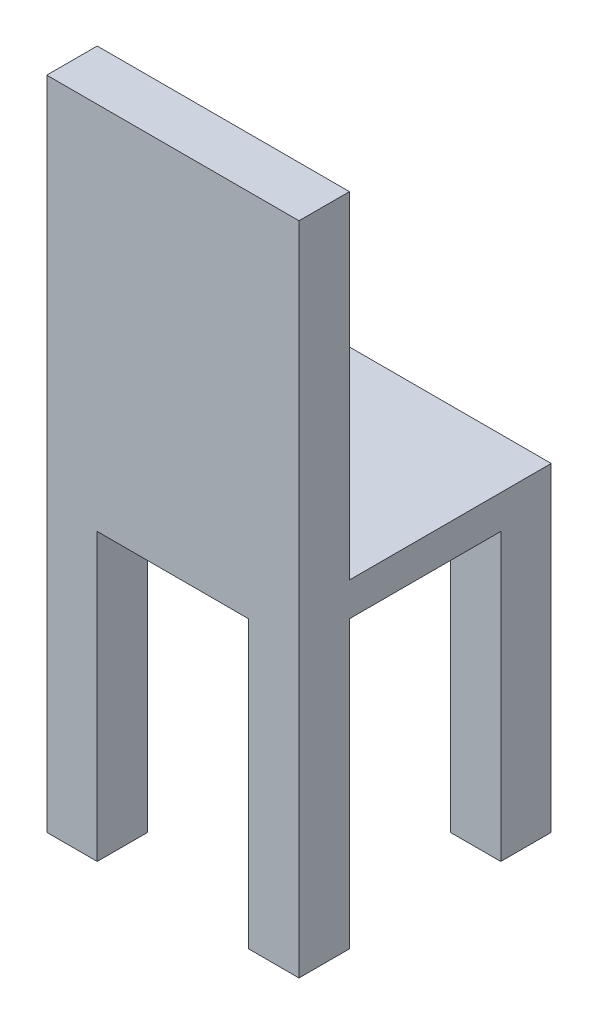
ISO-10303-21;
HEADER;
FILE_DESCRIPTION(('STEP AP214'),'2;1');
FILE_NAME('part.step','',(''),(''),'','','');
FILE_SCHEMA(('AUTOMOTIVE_DESIGN { 1 0 10303 214 1 1 1 1 }'));
ENDSEC;
DATA;
#1=APPLICATION_CONTEXT('core data for automotive mechanical design processes');
#2=APPLICATION_PROTOCOL_DEFINITION('international standard','automotive_design',2000,#1);
#3=PRODUCT_CONTEXT('',#1,'mechanical');
#4=PRODUCT('Part','Part','',(#3));
#5=PRODUCT_RELATED_PRODUCT_CATEGORY('part','',(#4));
#6=PRODUCT_DEFINITION_FORMATION('','',#4);
#7=PRODUCT_DEFINITION_CONTEXT('part definition',#1,'design');
#8=PRODUCT_DEFINITION('design','',#6,#7);
#9=PRODUCT_DEFINITION_SHAPE('','',#8);
#10=(LENGTH_UNIT() NAMED_UNIT(*) SI_UNIT(.MILLI.,.METRE.));
#11=(NAMED_UNIT(*) PLANE_ANGLE_UNIT() SI_UNIT($,.RADIAN.));
#12=(NAMED_UNIT(*) SI_UNIT($,.STERADIAN.) SOLID_ANGLE_UNIT());
#13=UNCERTAINTY_MEASURE_WITH_UNIT(LENGTH_MEASURE(1.E-05),#10,'distance_accuracy_value','');
#14=(GEOMETRIC_REPRESENTATION_CONTEXT(3) GLOBAL_UNCERTAINTY_ASSIGNED_CONTEXT((#13)) GLOBAL_UNIT_ASSIGNED_CONTEXT((#10,
#11,#12)) REPRESENTATION_CONTEXT('',''));
#15=CARTESIAN_POINT('',(0.,0.,0.));
#16=DIRECTION('',(0.,0.,1.));
#17=DIRECTION('',(1.,0.,0.));
#18=AXIS2_PLACEMENT_3D('',#15,#16,#17);
#19=CARTESIAN_POINT('',(0.,19.,0.));
#20=DIRECTION('',(0.,1.,0.));
#21=DIRECTION('',(0.,0.,1.));
#22=AXIS2_PLACEMENT_3D('',#19,#20,#21);
#23=PLANE('',#22);
#24=DIRECTION('',(0.,0.,1.));
#25=VECTOR('',#24,1.);
#26=CARTESIAN_POINT('',(22.1016011392974,19.,45.));
#27=LINE('',#26,#25);
#28=CARTESIAN_POINT('',(22.1016011392974,19.,45.));
#29=VERTEX_POINT('',#28);
#30=CARTESIAN_POINT('',(22.1016011392974,19.,48.));
#31=VERTEX_POINT('',#30);
#32=EDGE_CURVE('E216',#29,#31,#27,.T.);
#33=ORIENTED_EDGE('',*,*,#32,.T.);
#34=DIRECTION('',(1.,0.,0.));
#35=VECTOR('',#34,1.);
#36=CARTESIAN_POINT('',(25.1016011392974,19.,48.));
#37=LINE('',#36,#35);
#38=CARTESIAN_POINT('',(25.1016011392974,19.,48.));
#39=VERTEX_POINT('',#38);
#40=EDGE_CURVE('E211',#31,#39,#37,.T.);
#41=ORIENTED_EDGE('',*,*,#40,.T.);
#42=DIRECTION('',(0.,0.,-1.));
#43=VECTOR('',#42,1.);
#44=CARTESIAN_POINT('',(25.1016011392974,19.,45.));
#45=LINE('',#44,#43);
#46=CARTESIAN_POINT('',(25.1016011392974,19.,57.));
#47=VERTEX_POINT('',#46);
#48=EDGE_CURVE('E284',#47,#39,#45,.T.);
#49=ORIENTED_EDGE('',*,*,#48,.F.);
#50=DIRECTION('',(-1.,0.,0.));
#51=VECTOR('',#50,1.);
#52=CARTESIAN_POINT('',(25.1016011392974,19.,57.));
#53=LINE('',#52,#51);
#54=CARTESIAN_POINT('',(22.1016011392974,19.,57.));
#55=VERTEX_POINT('',#54);
#56=EDGE_CURVE('E42',#47,#55,#53,.T.);
#57=ORIENTED_EDGE('',*,*,#56,.T.);
#58=DIRECTION('',(0.,0.,1.));
#59=VECTOR('',#58,1.);
#60=CARTESIAN_POINT('',(22.1016011392974,19.,60.));
#61=LINE('',#60,#59);
#62=CARTESIAN_POINT('',(22.1016011392974,19.,60.));
#63=VERTEX_POINT('',#62);
#64=EDGE_CURVE('E299',#55,#63,#61,.T.);
#65=ORIENTED_EDGE('',*,*,#64,.T.);
#66=DIRECTION('',(1.,0.,0.));
#67=VECTOR('',#66,1.);
#68=CARTESIAN_POINT('',(10.1016011392974,19.,60.));
#69=LINE('',#68,#67);
#70=CARTESIAN_POINT('',(13.1016011392974,19.,60.));
#71=VERTEX_POINT('',#70);
#72=EDGE_CURVE('E282',#71,#63,#69,.T.);
#73=ORIENTED_EDGE('',*,*,#72,.F.);
#74=DIRECTION('',(0.,0.,-1.));
#75=VECTOR('',#74,1.);
#76=CARTESIAN_POINT('',(13.1016011392974,19.,60.));
#77=LINE('',#76,#75);
#78=CARTESIAN_POINT('',(13.1016011392974,19.,57.));
#79=VERTEX_POINT('',#78);
#80=EDGE_CURVE('E262',#71,#79,#77,.T.);
#81=ORIENTED_EDGE('',*,*,#80,.T.);
#82=DIRECTION('',(-1.,0.,0.));
#83=VECTOR('',#82,1.);
#84=CARTESIAN_POINT('',(10.1016011392974,19.,57.));
#85=LINE('',#84,#83);
#86=CARTESIAN_POINT('',(10.1016011392974,19.,57.));
#87=VERTEX_POINT('',#86);
#88=EDGE_CURVE('E259',#79,#87,#85,.T.);
#89=ORIENTED_EDGE('',*,*,#88,.T.);
#90=DIRECTION('',(0.,0.,1.));
#91=VECTOR('',#90,1.);
#92=CARTESIAN_POINT('',(10.1016011392974,19.,45.));
#93=LINE('',#92,#91);
#94=CARTESIAN_POINT('',(10.1016011392974,19.,48.));
#95=VERTEX_POINT('',#94);
#96=EDGE_CURVE('E268',#95,#87,#93,.T.);
#97=ORIENTED_EDGE('',*,*,#96,.F.);
#98=DIRECTION('',(1.,0.,0.));
#99=VECTOR('',#98,1.);
#100=CARTESIAN_POINT('',(10.1016011392974,19.,48.));
#101=LINE('',#100,#99);
#102=CARTESIAN_POINT('',(13.1016011392974,19.,48.));
#103=VERTEX_POINT('',#102);
#104=EDGE_CURVE('E230',#95,#103,#101,.T.);
#105=ORIENTED_EDGE('',*,*,#104,.T.);
#106=DIRECTION('',(0.,0.,-1.));
#107=VECTOR('',#106,1.);
#108=CARTESIAN_POINT('',(13.1016011392974,19.,45.));
#109=LINE('',#108,#107);
#110=CARTESIAN_POINT('',(13.1016011392974,19.,45.));
#111=VERTEX_POINT('',#110);
#112=EDGE_CURVE('E227',#103,#111,#109,.T.);
#113=ORIENTED_EDGE('',*,*,#112,.T.);
#114=DIRECTION('',(-1.,0.,0.));
#115=VECTOR('',#114,1.);
#116=CARTESIAN_POINT('',(10.1016011392974,19.,45.));
#117=LINE('',#116,#115);
#118=EDGE_CURVE('E276',#29,#111,#117,.T.);
#119=ORIENTED_EDGE('',*,*,#118,.F.);
#120=EDGE_LOOP('',(#33,#41,#49,#57,#65,#73,#81,#89,#97,#105,#113,#119));
#121=FACE_BOUND('',#120,.T.);
#122=ADVANCED_FACE('F38',(#121),#23,.F.);
#123=CARTESIAN_POINT('',(25.1016011392974,19.,60.));
#124=DIRECTION('',(-1.,0.,0.));
#125=DIRECTION('',(0.,0.,1.));
#126=AXIS2_PLACEMENT_3D('',#123,#124,#125);
#127=PLANE('',#126);
#128=DIRECTION('',(0.,0.,-1.));
#129=VECTOR('',#128,1.);
#130=CARTESIAN_POINT('',(25.1016011392974,2.,60.));
#131=LINE('',#130,#129);
#132=CARTESIAN_POINT('',(25.1016011392974,2.,60.));
#133=VERTEX_POINT('',#132);
#134=CARTESIAN_POINT('',(25.1016011392974,2.,57.));
#135=VERTEX_POINT('',#134);
#136=EDGE_CURVE('E11',#133,#135,#131,.T.);
#137=ORIENTED_EDGE('',*,*,#136,.T.);
#138=DIRECTION('',(0.,-1.,0.));
#139=VECTOR('',#138,1.);
#140=CARTESIAN_POINT('',(25.1016011392974,19.,57.));
#141=LINE('',#140,#139);
#142=EDGE_CURVE('E178',#47,#135,#141,.T.);
#143=ORIENTED_EDGE('',*,*,#142,.F.);
#144=ORIENTED_EDGE('',*,*,#48,.T.);
#145=DIRECTION('',(0.,-1.,0.));
#146=VECTOR('',#145,1.);
#147=CARTESIAN_POINT('',(25.1016011392974,19.,48.));
#148=LINE('',#147,#146);
#149=CARTESIAN_POINT('',(25.1016011392974,2.,48.));
#150=VERTEX_POINT('',#149);
#151=EDGE_CURVE('E208',#39,#150,#148,.T.);
#152=ORIENTED_EDGE('',*,*,#151,.T.);
#153=DIRECTION('',(0.,0.,-1.));
#154=VECTOR('',#153,1.);
#155=CARTESIAN_POINT('',(25.1016011392974,2.,45.));
#156=LINE('',#155,#154);
#157=CARTESIAN_POINT('',(25.1016011392974,2.,45.));
#158=VERTEX_POINT('',#157);
#159=EDGE_CURVE('E212',#150,#158,#156,.T.);
#160=ORIENTED_EDGE('',*,*,#159,.T.);
#161=DIRECTION('',(0.,-1.,0.));
#162=VECTOR('',#161,1.);
#163=CARTESIAN_POINT('',(25.1016011392974,21.,45.));
#164=LINE('',#163,#162);
#165=CARTESIAN_POINT('',(25.1016011392974,21.,45.));
#166=VERTEX_POINT('',#165);
#167=EDGE_CURVE('E179',#166,#158,#164,.T.);
#168=ORIENTED_EDGE('',*,*,#167,.F.);
#169=DIRECTION('',(0.,0.,-1.));
#170=VECTOR('',#169,1.);
#171=CARTESIAN_POINT('',(25.1016011392974,21.,45.));
#172=LINE('',#171,#170);
#173=CARTESIAN_POINT('',(25.1016011392974,21.,57.));
#174=VERTEX_POINT('',#173);
#175=EDGE_CURVE('E275',#174,#166,#172,.T.);
#176=ORIENTED_EDGE('',*,*,#175,.F.);
#177=DIRECTION('',(0.,-1.,0.));
#178=VECTOR('',#177,1.);
#179=CARTESIAN_POINT('',(25.1016011392974,41.,57.));
#180=LINE('',#179,#178);
#181=CARTESIAN_POINT('',(25.1016011392974,41.,57.));
#182=VERTEX_POINT('',#181);
#183=EDGE_CURVE('E201',#182,#174,#180,.T.);
#184=ORIENTED_EDGE('',*,*,#183,.F.);
#185=DIRECTION('',(0.,0.,-1.));
#186=VECTOR('',#185,1.);
#187=CARTESIAN_POINT('',(25.1016011392974,41.,60.));
#188=LINE('',#187,#186);
#189=CARTESIAN_POINT('',(25.1016011392974,41.,60.));
#190=VERTEX_POINT('',#189);
#191=EDGE_CURVE('E188',#190,#182,#188,.T.);
#192=ORIENTED_EDGE('',*,*,#191,.F.);
#193=DIRECTION('',(0.,-1.,0.));
#194=VECTOR('',#193,1.);
#195=CARTESIAN_POINT('',(25.1016011392974,19.,60.));
#196=LINE('',#195,#194);
#197=EDGE_CURVE('E185',#190,#133,#196,.T.);
#198=ORIENTED_EDGE('',*,*,#197,.T.);
#199=EDGE_LOOP('',(#137,#143,#144,#152,#160,#168,#176,#184,#192,#198));
#200=FACE_BOUND('',#199,.T.);
#201=ADVANCED_FACE('F314',(#200),#127,.F.);
#202=CARTESIAN_POINT('',(25.1016011392974,19.,57.));
#203=DIRECTION('',(0.,0.,1.));
#204=DIRECTION('',(1.,0.,0.));
#205=AXIS2_PLACEMENT_3D('',#202,#203,#204);
#206=PLANE('',#205);
#207=DIRECTION('',(-1.,0.,0.));
#208=VECTOR('',#207,1.);
#209=CARTESIAN_POINT('',(25.1016011392974,2.,57.));
#210=LINE('',#209,#208);
#211=CARTESIAN_POINT('',(22.1016011392974,2.,57.));
#212=VERTEX_POINT('',#211);
#213=EDGE_CURVE('E47',#135,#212,#210,.T.);
#214=ORIENTED_EDGE('',*,*,#213,.T.);
#215=DIRECTION('',(0.,-1.,0.));
#216=VECTOR('',#215,1.);
#217=CARTESIAN_POINT('',(22.1016011392974,19.,57.));
#218=LINE('',#217,#216);
#219=EDGE_CURVE('E292',#55,#212,#218,.T.);
#220=ORIENTED_EDGE('',*,*,#219,.F.);
#221=ORIENTED_EDGE('',*,*,#56,.F.);
#222=ORIENTED_EDGE('',*,*,#142,.T.);
#223=EDGE_LOOP('',(#214,#220,#221,#222));
#224=FACE_BOUND('',#223,.T.);
#225=ADVANCED_FACE('F312',(#224),#206,.F.);
#226=CARTESIAN_POINT('',(22.1016011392974,19.,60.));
#227=DIRECTION('',(1.,0.,0.));
#228=DIRECTION('',(0.,0.,-1.));
#229=AXIS2_PLACEMENT_3D('',#226,#227,#228);
#230=PLANE('',#229);
#231=DIRECTION('',(0.,0.,1.));
#232=VECTOR('',#231,1.);
#233=CARTESIAN_POINT('',(22.1016011392974,2.,60.));
#234=LINE('',#233,#232);
#235=CARTESIAN_POINT('',(22.1016011392974,2.,60.));
#236=VERTEX_POINT('',#235);
#237=EDGE_CURVE('E302',#212,#236,#234,.T.);
#238=ORIENTED_EDGE('',*,*,#237,.T.);
#239=DIRECTION('',(0.,-1.,0.));
#240=VECTOR('',#239,1.);
#241=CARTESIAN_POINT('',(22.1016011392974,19.,60.));
#242=LINE('',#241,#240);
#243=EDGE_CURVE('E295',#63,#236,#242,.T.);
#244=ORIENTED_EDGE('',*,*,#243,.F.);
#245=ORIENTED_EDGE('',*,*,#64,.F.);
#246=ORIENTED_EDGE('',*,*,#219,.T.);
#247=EDGE_LOOP('',(#238,#244,#245,#246));
#248=FACE_BOUND('',#247,.T.);
#249=ADVANCED_FACE('F320',(#248),#230,.F.);
#250=CARTESIAN_POINT('',(25.1016011392974,19.,60.));
#251=DIRECTION('',(0.,0.,-1.));
#252=DIRECTION('',(-1.,0.,0.));
#253=AXIS2_PLACEMENT_3D('',#250,#251,#252);
#254=PLANE('',#253);
#255=DIRECTION('',(1.,0.,0.));
#256=VECTOR('',#255,1.);
#257=CARTESIAN_POINT('',(25.1016011392974,2.,60.));
#258=LINE('',#257,#256);
#259=EDGE_CURVE('E300',#236,#133,#258,.T.);
#260=ORIENTED_EDGE('',*,*,#259,.T.);
#261=ORIENTED_EDGE('',*,*,#197,.F.);
#262=DIRECTION('',(1.,0.,0.));
#263=VECTOR('',#262,1.);
#264=CARTESIAN_POINT('',(10.1016011392974,41.,60.));
#265=LINE('',#264,#263);
#266=CARTESIAN_POINT('',(10.1016011392974,41.,60.));
#267=VERTEX_POINT('',#266);
#268=EDGE_CURVE('E182',#267,#190,#265,.T.);
#269=ORIENTED_EDGE('',*,*,#268,.F.);
#270=DIRECTION('',(0.,-1.,0.));
#271=VECTOR('',#270,1.);
#272=CARTESIAN_POINT('',(10.1016011392974,21.,60.));
#273=LINE('',#272,#271);
#274=CARTESIAN_POINT('',(10.1016011392974,2.,60.));
#275=VERTEX_POINT('',#274);
#276=EDGE_CURVE('E166',#267,#275,#273,.T.);
#277=ORIENTED_EDGE('',*,*,#276,.T.);
#278=DIRECTION('',(1.,0.,0.));
#279=VECTOR('',#278,1.);
#280=CARTESIAN_POINT('',(10.1016011392974,2.,60.));
#281=LINE('',#280,#279);
#282=CARTESIAN_POINT('',(13.1016011392974,2.,60.));
#283=VERTEX_POINT('',#282);
#284=EDGE_CURVE('E266',#275,#283,#281,.T.);
#285=ORIENTED_EDGE('',*,*,#284,.T.);
#286=DIRECTION('',(0.,-1.,0.));
#287=VECTOR('',#286,1.);
#288=CARTESIAN_POINT('',(13.1016011392974,19.,60.));
#289=LINE('',#288,#287);
#290=EDGE_CURVE('E251',#71,#283,#289,.T.);
#291=ORIENTED_EDGE('',*,*,#290,.F.);
#292=ORIENTED_EDGE('',*,*,#72,.T.);
#293=ORIENTED_EDGE('',*,*,#243,.T.);
#294=EDGE_LOOP('',(#260,#261,#269,#277,#285,#291,#292,#293));
#295=FACE_BOUND('',#294,.T.);
#296=ADVANCED_FACE('F183',(#295),#254,.F.);
#297=CARTESIAN_POINT('',(0.,2.,0.));
#298=DIRECTION('',(0.,1.,0.));
#299=DIRECTION('',(0.,0.,1.));
#300=AXIS2_PLACEMENT_3D('',#297,#298,#299);
#301=PLANE('',#300);
#302=ORIENTED_EDGE('',*,*,#136,.F.);
#303=ORIENTED_EDGE('',*,*,#259,.F.);
#304=ORIENTED_EDGE('',*,*,#237,.F.);
#305=ORIENTED_EDGE('',*,*,#213,.F.);
#306=EDGE_LOOP('',(#302,#303,#304,#305));
#307=FACE_BOUND('',#306,.T.);
#308=ADVANCED_FACE('F40',(#307),#301,.F.);
#309=CARTESIAN_POINT('',(10.1016011392974,21.,45.));
#310=DIRECTION('',(1.,0.,0.));
#311=DIRECTION('',(0.,0.,-1.));
#312=AXIS2_PLACEMENT_3D('',#309,#310,#311);
#313=PLANE('',#312);
#314=DIRECTION('',(0.,-1.,0.));
#315=VECTOR('',#314,1.);
#316=CARTESIAN_POINT('',(10.1016011392974,21.,45.));
#317=LINE('',#316,#315);
#318=CARTESIAN_POINT('',(10.1016011392974,21.,45.));
#319=VERTEX_POINT('',#318);
#320=CARTESIAN_POINT('',(10.1016011392974,2.,45.));
#321=VERTEX_POINT('',#320);
#322=EDGE_CURVE('E280',#319,#321,#317,.T.);
#323=ORIENTED_EDGE('',*,*,#322,.T.);
#324=DIRECTION('',(0.,0.,1.));
#325=VECTOR('',#324,1.);
#326=CARTESIAN_POINT('',(10.1016011392974,2.,45.));
#327=LINE('',#326,#325);
#328=CARTESIAN_POINT('',(10.1016011392974,2.,48.));
#329=VERTEX_POINT('',#328);
#330=EDGE_CURVE('E240',#321,#329,#327,.T.);
#331=ORIENTED_EDGE('',*,*,#330,.T.);
#332=DIRECTION('',(0.,-1.,0.));
#333=VECTOR('',#332,1.);
#334=CARTESIAN_POINT('',(10.1016011392974,19.,48.));
#335=LINE('',#334,#333);
#336=EDGE_CURVE('E245',#95,#329,#335,.T.);
#337=ORIENTED_EDGE('',*,*,#336,.F.);
#338=ORIENTED_EDGE('',*,*,#96,.T.);
#339=DIRECTION('',(0.,-1.,0.));
#340=VECTOR('',#339,1.);
#341=CARTESIAN_POINT('',(10.1016011392974,19.,57.));
#342=LINE('',#341,#340);
#343=CARTESIAN_POINT('',(10.1016011392974,2.,57.));
#344=VERTEX_POINT('',#343);
#345=EDGE_CURVE('E257',#87,#344,#342,.T.);
#346=ORIENTED_EDGE('',*,*,#345,.T.);
#347=DIRECTION('',(0.,0.,1.));
#348=VECTOR('',#347,1.);
#349=CARTESIAN_POINT('',(10.1016011392974,2.,60.));
#350=LINE('',#349,#348);
#351=EDGE_CURVE('E174',#344,#275,#350,.T.);
#352=ORIENTED_EDGE('',*,*,#351,.T.);
#353=ORIENTED_EDGE('',*,*,#276,.F.);
#354=DIRECTION('',(0.,0.,1.));
#355=VECTOR('',#354,1.);
#356=CARTESIAN_POINT('',(10.1016011392974,41.,60.));
#357=LINE('',#356,#355);
#358=CARTESIAN_POINT('',(10.1016011392974,41.,57.));
#359=VERTEX_POINT('',#358);
#360=EDGE_CURVE('E171',#359,#267,#357,.T.);
#361=ORIENTED_EDGE('',*,*,#360,.F.);
#362=DIRECTION('',(0.,-1.,0.));
#363=VECTOR('',#362,1.);
#364=CARTESIAN_POINT('',(10.1016011392974,41.,57.));
#365=LINE('',#364,#363);
#366=CARTESIAN_POINT('',(10.1016011392974,21.,57.));
#367=VERTEX_POINT('',#366);
#368=EDGE_CURVE('E198',#359,#367,#365,.T.);
#369=ORIENTED_EDGE('',*,*,#368,.T.);
#370=DIRECTION('',(0.,0.,1.));
#371=VECTOR('',#370,1.);
#372=CARTESIAN_POINT('',(10.1016011392974,21.,45.));
#373=LINE('',#372,#371);
#374=EDGE_CURVE('E273',#319,#367,#373,.T.);
#375=ORIENTED_EDGE('',*,*,#374,.F.);
#376=EDGE_LOOP('',(#323,#331,#337,#338,#346,#352,#353,#361,#369,#375));
#377=FACE_BOUND('',#376,.T.);
#378=ADVANCED_FACE('F168',(#377),#313,.F.);
#379=CARTESIAN_POINT('',(10.1016011392974,21.,45.));
#380=DIRECTION('',(0.,0.,1.));
#381=DIRECTION('',(1.,0.,0.));
#382=AXIS2_PLACEMENT_3D('',#379,#380,#381);
#383=PLANE('',#382);
#384=ORIENTED_EDGE('',*,*,#167,.T.);
#385=DIRECTION('',(-1.,0.,0.));
#386=VECTOR('',#385,1.);
#387=CARTESIAN_POINT('',(25.1016011392974,2.,45.));
#388=LINE('',#387,#386);
#389=CARTESIAN_POINT('',(22.1016011392974,2.,45.));
#390=VERTEX_POINT('',#389);
#391=EDGE_CURVE('E220',#158,#390,#388,.T.);
#392=ORIENTED_EDGE('',*,*,#391,.T.);
#393=DIRECTION('',(0.,-1.,0.));
#394=VECTOR('',#393,1.);
#395=CARTESIAN_POINT('',(22.1016011392974,19.,45.));
#396=LINE('',#395,#394);
#397=EDGE_CURVE('E63',#29,#390,#396,.T.);
#398=ORIENTED_EDGE('',*,*,#397,.F.);
#399=ORIENTED_EDGE('',*,*,#118,.T.);
#400=DIRECTION('',(0.,-1.,0.));
#401=VECTOR('',#400,1.);
#402=CARTESIAN_POINT('',(13.1016011392974,19.,45.));
#403=LINE('',#402,#401);
#404=CARTESIAN_POINT('',(13.1016011392974,2.,45.));
#405=VERTEX_POINT('',#404);
#406=EDGE_CURVE('E248',#111,#405,#403,.T.);
#407=ORIENTED_EDGE('',*,*,#406,.T.);
#408=DIRECTION('',(-1.,0.,0.));
#409=VECTOR('',#408,1.);
#410=CARTESIAN_POINT('',(10.1016011392974,2.,45.));
#411=LINE('',#410,#409);
#412=EDGE_CURVE('E237',#405,#321,#411,.T.);
#413=ORIENTED_EDGE('',*,*,#412,.T.);
#414=ORIENTED_EDGE('',*,*,#322,.F.);
#415=DIRECTION('',(-1.,0.,0.));
#416=VECTOR('',#415,1.);
#417=CARTESIAN_POINT('',(10.1016011392974,21.,45.));
#418=LINE('',#417,#416);
#419=EDGE_CURVE('E278',#166,#319,#418,.T.);
#420=ORIENTED_EDGE('',*,*,#419,.F.);
#421=EDGE_LOOP('',(#384,#392,#398,#399,#407,#413,#414,#420));
#422=FACE_BOUND('',#421,.T.);
#423=ADVANCED_FACE('F353',(#422),#383,.F.);
#424=CARTESIAN_POINT('',(0.,21.,0.));
#425=DIRECTION('',(0.,1.,0.));
#426=DIRECTION('',(0.,0.,1.));
#427=AXIS2_PLACEMENT_3D('',#424,#425,#426);
#428=PLANE('',#427);
#429=DIRECTION('',(-1.,0.,0.));
#430=VECTOR('',#429,1.);
#431=CARTESIAN_POINT('',(10.1016011392974,21.,57.));
#432=LINE('',#431,#430);
#433=EDGE_CURVE('E55',#174,#367,#432,.T.);
#434=ORIENTED_EDGE('',*,*,#433,.F.);
#435=ORIENTED_EDGE('',*,*,#175,.T.);
#436=ORIENTED_EDGE('',*,*,#419,.T.);
#437=ORIENTED_EDGE('',*,*,#374,.T.);
#438=EDGE_LOOP('',(#434,#435,#436,#437));
#439=FACE_BOUND('',#438,.T.);
#440=ADVANCED_FACE('F352',(#439),#428,.T.);
#441=CARTESIAN_POINT('',(13.1016011392974,19.,60.));
#442=DIRECTION('',(-1.,0.,0.));
#443=DIRECTION('',(0.,0.,1.));
#444=AXIS2_PLACEMENT_3D('',#441,#442,#443);
#445=PLANE('',#444);
#446=DIRECTION('',(0.,0.,-1.));
#447=VECTOR('',#446,1.);
#448=CARTESIAN_POINT('',(13.1016011392974,2.,60.));
#449=LINE('',#448,#447);
#450=CARTESIAN_POINT('',(13.1016011392974,2.,57.));
#451=VERTEX_POINT('',#450);
#452=EDGE_CURVE('E264',#283,#451,#449,.T.);
#453=ORIENTED_EDGE('',*,*,#452,.T.);
#454=DIRECTION('',(0.,-1.,0.));
#455=VECTOR('',#454,1.);
#456=CARTESIAN_POINT('',(13.1016011392974,19.,57.));
#457=LINE('',#456,#455);
#458=EDGE_CURVE('E254',#79,#451,#457,.T.);
#459=ORIENTED_EDGE('',*,*,#458,.F.);
#460=ORIENTED_EDGE('',*,*,#80,.F.);
#461=ORIENTED_EDGE('',*,*,#290,.T.);
#462=EDGE_LOOP('',(#453,#459,#460,#461));
#463=FACE_BOUND('',#462,.T.);
#464=ADVANCED_FACE('F326',(#463),#445,.F.);
#465=CARTESIAN_POINT('',(10.1016011392974,19.,57.));
#466=DIRECTION('',(0.,0.,1.));
#467=DIRECTION('',(1.,0.,0.));
#468=AXIS2_PLACEMENT_3D('',#465,#466,#467);
#469=PLANE('',#468);
#470=DIRECTION('',(-1.,0.,0.));
#471=VECTOR('',#470,1.);
#472=CARTESIAN_POINT('',(10.1016011392974,2.,57.));
#473=LINE('',#472,#471);
#474=EDGE_CURVE('E261',#451,#344,#473,.T.);
#475=ORIENTED_EDGE('',*,*,#474,.T.);
#476=ORIENTED_EDGE('',*,*,#345,.F.);
#477=ORIENTED_EDGE('',*,*,#88,.F.);
#478=ORIENTED_EDGE('',*,*,#458,.T.);
#479=EDGE_LOOP('',(#475,#476,#477,#478));
#480=FACE_BOUND('',#479,.T.);
#481=ADVANCED_FACE('F330',(#480),#469,.F.);
#482=CARTESIAN_POINT('',(0.,2.,0.));
#483=DIRECTION('',(0.,1.,0.));
#484=DIRECTION('',(0.,0.,1.));
#485=AXIS2_PLACEMENT_3D('',#482,#483,#484);
#486=PLANE('',#485);
#487=ORIENTED_EDGE('',*,*,#284,.F.);
#488=ORIENTED_EDGE('',*,*,#351,.F.);
#489=ORIENTED_EDGE('',*,*,#474,.F.);
#490=ORIENTED_EDGE('',*,*,#452,.F.);
#491=EDGE_LOOP('',(#487,#488,#489,#490));
#492=FACE_BOUND('',#491,.T.);
#493=ADVANCED_FACE('F332',(#492),#486,.F.);
#494=CARTESIAN_POINT('',(13.1016011392974,19.,45.));
#495=DIRECTION('',(-1.,0.,0.));
#496=DIRECTION('',(0.,0.,1.));
#497=AXIS2_PLACEMENT_3D('',#494,#495,#496);
#498=PLANE('',#497);
#499=DIRECTION('',(0.,0.,-1.));
#500=VECTOR('',#499,1.);
#501=CARTESIAN_POINT('',(13.1016011392974,2.,45.));
#502=LINE('',#501,#500);
#503=CARTESIAN_POINT('',(13.1016011392974,2.,48.));
#504=VERTEX_POINT('',#503);
#505=EDGE_CURVE('E222',#504,#405,#502,.T.);
#506=ORIENTED_EDGE('',*,*,#505,.T.);
#507=ORIENTED_EDGE('',*,*,#406,.F.);
#508=ORIENTED_EDGE('',*,*,#112,.F.);
#509=DIRECTION('',(0.,-1.,0.));
#510=VECTOR('',#509,1.);
#511=CARTESIAN_POINT('',(13.1016011392974,19.,48.));
#512=LINE('',#511,#510);
#513=EDGE_CURVE('E234',#103,#504,#512,.T.);
#514=ORIENTED_EDGE('',*,*,#513,.T.);
#515=EDGE_LOOP('',(#506,#507,#508,#514));
#516=FACE_BOUND('',#515,.T.);
#517=ADVANCED_FACE('F334',(#516),#498,.F.);
#518=CARTESIAN_POINT('',(10.1016011392974,19.,48.));
#519=DIRECTION('',(0.,0.,-1.));
#520=DIRECTION('',(-1.,0.,0.));
#521=AXIS2_PLACEMENT_3D('',#518,#519,#520);
#522=PLANE('',#521);
#523=DIRECTION('',(1.,0.,0.));
#524=VECTOR('',#523,1.);
#525=CARTESIAN_POINT('',(10.1016011392974,2.,48.));
#526=LINE('',#525,#524);
#527=EDGE_CURVE('E231',#329,#504,#526,.T.);
#528=ORIENTED_EDGE('',*,*,#527,.T.);
#529=ORIENTED_EDGE('',*,*,#513,.F.);
#530=ORIENTED_EDGE('',*,*,#104,.F.);
#531=ORIENTED_EDGE('',*,*,#336,.T.);
#532=EDGE_LOOP('',(#528,#529,#530,#531));
#533=FACE_BOUND('',#532,.T.);
#534=ADVANCED_FACE('F340',(#533),#522,.F.);
#535=CARTESIAN_POINT('',(0.,2.,0.));
#536=DIRECTION('',(0.,1.,0.));
#537=DIRECTION('',(0.,0.,1.));
#538=AXIS2_PLACEMENT_3D('',#535,#536,#537);
#539=PLANE('',#538);
#540=ORIENTED_EDGE('',*,*,#505,.F.);
#541=ORIENTED_EDGE('',*,*,#527,.F.);
#542=ORIENTED_EDGE('',*,*,#330,.F.);
#543=ORIENTED_EDGE('',*,*,#412,.F.);
#544=EDGE_LOOP('',(#540,#541,#542,#543));
#545=FACE_BOUND('',#544,.T.);
#546=ADVANCED_FACE('F421',(#545),#539,.F.);
#547=CARTESIAN_POINT('',(22.1016011392974,19.,45.));
#548=DIRECTION('',(1.,0.,0.));
#549=DIRECTION('',(0.,0.,-1.));
#550=AXIS2_PLACEMENT_3D('',#547,#548,#549);
#551=PLANE('',#550);
#552=DIRECTION('',(0.,0.,1.));
#553=VECTOR('',#552,1.);
#554=CARTESIAN_POINT('',(22.1016011392974,2.,45.));
#555=LINE('',#554,#553);
#556=CARTESIAN_POINT('',(22.1016011392974,2.,48.));
#557=VERTEX_POINT('',#556);
#558=EDGE_CURVE('E218',#390,#557,#555,.T.);
#559=ORIENTED_EDGE('',*,*,#558,.T.);
#560=DIRECTION('',(0.,-1.,0.));
#561=VECTOR('',#560,1.);
#562=CARTESIAN_POINT('',(22.1016011392974,19.,48.));
#563=LINE('',#562,#561);
#564=EDGE_CURVE('E205',#31,#557,#563,.T.);
#565=ORIENTED_EDGE('',*,*,#564,.F.);
#566=ORIENTED_EDGE('',*,*,#32,.F.);
#567=ORIENTED_EDGE('',*,*,#397,.T.);
#568=EDGE_LOOP('',(#559,#565,#566,#567));
#569=FACE_BOUND('',#568,.T.);
#570=ADVANCED_FACE('F432',(#569),#551,.F.);
#571=CARTESIAN_POINT('',(25.1016011392974,19.,48.));
#572=DIRECTION('',(0.,0.,-1.));
#573=DIRECTION('',(-1.,0.,0.));
#574=AXIS2_PLACEMENT_3D('',#571,#572,#573);
#575=PLANE('',#574);
#576=DIRECTION('',(1.,0.,0.));
#577=VECTOR('',#576,1.);
#578=CARTESIAN_POINT('',(25.1016011392974,2.,48.));
#579=LINE('',#578,#577);
#580=EDGE_CURVE('E215',#557,#150,#579,.T.);
#581=ORIENTED_EDGE('',*,*,#580,.T.);
#582=ORIENTED_EDGE('',*,*,#151,.F.);
#583=ORIENTED_EDGE('',*,*,#40,.F.);
#584=ORIENTED_EDGE('',*,*,#564,.T.);
#585=EDGE_LOOP('',(#581,#582,#583,#584));
#586=FACE_BOUND('',#585,.T.);
#587=ADVANCED_FACE('F443',(#586),#575,.F.);
#588=CARTESIAN_POINT('',(0.,2.,0.));
#589=DIRECTION('',(0.,1.,0.));
#590=DIRECTION('',(0.,0.,1.));
#591=AXIS2_PLACEMENT_3D('',#588,#589,#590);
#592=PLANE('',#591);
#593=ORIENTED_EDGE('',*,*,#391,.F.);
#594=ORIENTED_EDGE('',*,*,#159,.F.);
#595=ORIENTED_EDGE('',*,*,#580,.F.);
#596=ORIENTED_EDGE('',*,*,#558,.F.);
#597=EDGE_LOOP('',(#593,#594,#595,#596));
#598=FACE_BOUND('',#597,.T.);
#599=ADVANCED_FACE('F454',(#598),#592,.F.);
#600=CARTESIAN_POINT('',(10.1016011392974,41.,57.));
#601=DIRECTION('',(0.,0.,1.));
#602=DIRECTION('',(1.,0.,0.));
#603=AXIS2_PLACEMENT_3D('',#600,#601,#602);
#604=PLANE('',#603);
#605=ORIENTED_EDGE('',*,*,#433,.T.);
#606=ORIENTED_EDGE('',*,*,#368,.F.);
#607=DIRECTION('',(-1.,0.,0.));
#608=VECTOR('',#607,1.);
#609=CARTESIAN_POINT('',(10.1016011392974,41.,57.));
#610=LINE('',#609,#608);
#611=EDGE_CURVE('E192',#182,#359,#610,.T.);
#612=ORIENTED_EDGE('',*,*,#611,.F.);
#613=ORIENTED_EDGE('',*,*,#183,.T.);
#614=EDGE_LOOP('',(#605,#606,#612,#613));
#615=FACE_BOUND('',#614,.T.);
#616=ADVANCED_FACE('F465',(#615),#604,.F.);
#617=CARTESIAN_POINT('',(0.,41.,0.));
#618=DIRECTION('',(0.,-1.,0.));
#619=DIRECTION('',(0.,0.,-1.));
#620=AXIS2_PLACEMENT_3D('',#617,#618,#619);
#621=PLANE('',#620);
#622=ORIENTED_EDGE('',*,*,#360,.T.);
#623=ORIENTED_EDGE('',*,*,#268,.T.);
#624=ORIENTED_EDGE('',*,*,#191,.T.);
#625=ORIENTED_EDGE('',*,*,#611,.T.);
#626=EDGE_LOOP('',(#622,#623,#624,#625));
#627=FACE_BOUND('',#626,.T.);
#628=ADVANCED_FACE('F190',(#627),#621,.F.);
#629=CLOSED_SHELL('',(#122,#201,#225,#249,#296,#308,#378,#423,#440,#464,#481,#493,#517,#534,
#546,#570,#587,#599,#616,#628));
#630=MANIFOLD_SOLID_BREP('B2',#629);
#631=ADVANCED_BREP_SHAPE_REPRESENTATION('',(#18,#630),#14);
#632=SHAPE_DEFINITION_REPRESENTATION(#9,#631);
ENDSEC;
END-ISO-10303-21;
